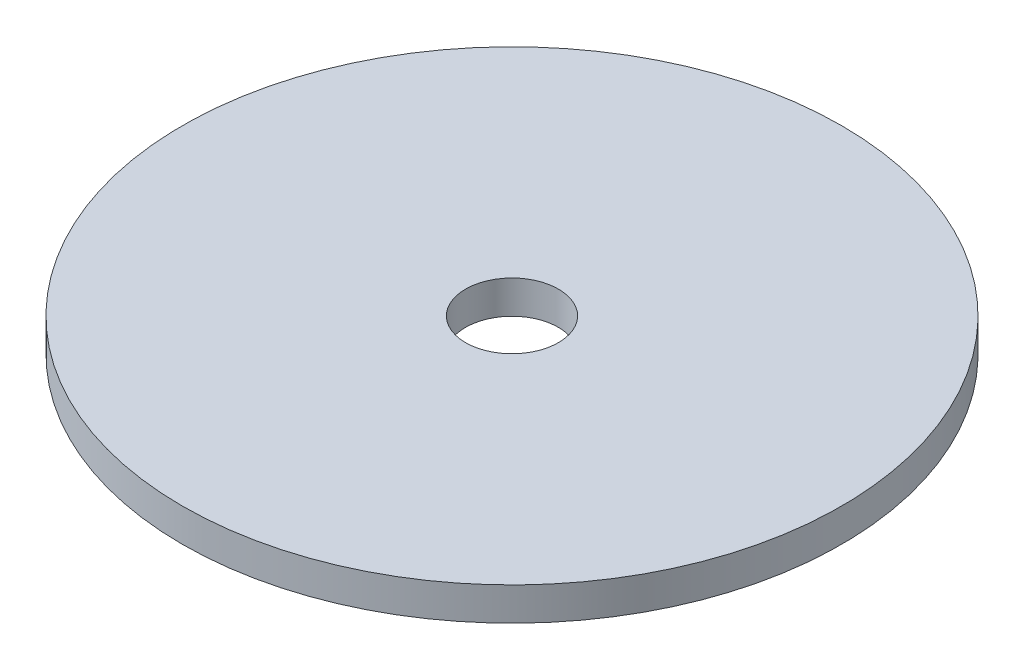
ISO-10303-21;
HEADER;
FILE_DESCRIPTION(('STEP AP214'),'2;1');
FILE_NAME('part.step','',(''),(''),'','','');
FILE_SCHEMA(('AUTOMOTIVE_DESIGN { 1 0 10303 214 1 1 1 1 }'));
ENDSEC;
DATA;
#1=APPLICATION_CONTEXT('core data for automotive mechanical design processes');
#2=APPLICATION_PROTOCOL_DEFINITION('international standard','automotive_design',2000,#1);
#3=PRODUCT_CONTEXT('',#1,'mechanical');
#4=PRODUCT('Part','Part','',(#3));
#5=PRODUCT_RELATED_PRODUCT_CATEGORY('part','',(#4));
#6=PRODUCT_DEFINITION_FORMATION('','',#4);
#7=PRODUCT_DEFINITION_CONTEXT('part definition',#1,'design');
#8=PRODUCT_DEFINITION('design','',#6,#7);
#9=PRODUCT_DEFINITION_SHAPE('','',#8);
#10=(LENGTH_UNIT() NAMED_UNIT(*) SI_UNIT(.MILLI.,.METRE.));
#11=(NAMED_UNIT(*) PLANE_ANGLE_UNIT() SI_UNIT($,.RADIAN.));
#12=(NAMED_UNIT(*) SI_UNIT($,.STERADIAN.) SOLID_ANGLE_UNIT());
#13=UNCERTAINTY_MEASURE_WITH_UNIT(LENGTH_MEASURE(1.E-05),#10,'distance_accuracy_value','');
#14=(GEOMETRIC_REPRESENTATION_CONTEXT(3) GLOBAL_UNCERTAINTY_ASSIGNED_CONTEXT((#13)) GLOBAL_UNIT_ASSIGNED_CONTEXT((#10,
#11,#12)) REPRESENTATION_CONTEXT('',''));
#15=CARTESIAN_POINT('',(0.,0.,0.));
#16=DIRECTION('',(0.,0.,1.));
#17=DIRECTION('',(1.,0.,0.));
#18=AXIS2_PLACEMENT_3D('',#15,#16,#17);
#19=CARTESIAN_POINT('',(0.,6.125,0.));
#20=DIRECTION('',(0.,1.,0.));
#21=DIRECTION('',(0.,0.,1.));
#22=AXIS2_PLACEMENT_3D('',#19,#20,#21);
#23=PLANE('',#22);
#24=CARTESIAN_POINT('',(0.,6.125,0.));
#25=DIRECTION('',(0.,1.,0.));
#26=DIRECTION('',(0.,0.,1.));
#27=AXIS2_PLACEMENT_3D('',#24,#25,#26);
#28=CIRCLE('',#27,121.765);
#29=CARTESIAN_POINT('',(0.,6.125,121.765));
#30=VERTEX_POINT('',#29);
#31=EDGE_CURVE('E10',#30,#30,#28,.T.);
#32=ORIENTED_EDGE('',*,*,#31,.T.);
#33=EDGE_LOOP('',(#32));
#34=FACE_BOUND('',#33,.T.);
#35=CARTESIAN_POINT('',(0.,6.125,0.));
#36=DIRECTION('',(0.,1.,0.));
#37=DIRECTION('',(0.,0.,1.));
#38=AXIS2_PLACEMENT_3D('',#35,#36,#37);
#39=CIRCLE('',#38,17.15);
#40=CARTESIAN_POINT('',(0.,6.125,17.15));
#41=VERTEX_POINT('',#40);
#42=EDGE_CURVE('E46',#41,#41,#39,.T.);
#43=ORIENTED_EDGE('',*,*,#42,.F.);
#44=EDGE_LOOP('',(#43));
#45=FACE_BOUND('',#44,.T.);
#46=ADVANCED_FACE('F35',(#34,#45),#23,.T.);
#47=CARTESIAN_POINT('',(0.,-6.125,0.));
#48=DIRECTION('',(0.,1.,0.));
#49=DIRECTION('',(0.,0.,1.));
#50=AXIS2_PLACEMENT_3D('',#47,#48,#49);
#51=PLANE('',#50);
#52=CARTESIAN_POINT('',(0.,-6.125,0.));
#53=DIRECTION('',(0.,1.,0.));
#54=DIRECTION('',(0.,0.,1.));
#55=AXIS2_PLACEMENT_3D('',#52,#53,#54);
#56=CIRCLE('',#55,121.765);
#57=CARTESIAN_POINT('',(0.,-6.125,121.765));
#58=VERTEX_POINT('',#57);
#59=EDGE_CURVE('E39',#58,#58,#56,.T.);
#60=ORIENTED_EDGE('',*,*,#59,.F.);
#61=EDGE_LOOP('',(#60));
#62=FACE_BOUND('',#61,.T.);
#63=CARTESIAN_POINT('',(0.,-6.125,0.));
#64=DIRECTION('',(0.,1.,0.));
#65=DIRECTION('',(0.,0.,1.));
#66=AXIS2_PLACEMENT_3D('',#63,#64,#65);
#67=CIRCLE('',#66,17.15);
#68=CARTESIAN_POINT('',(0.,-6.125,17.15));
#69=VERTEX_POINT('',#68);
#70=EDGE_CURVE('E48',#69,#69,#67,.T.);
#71=ORIENTED_EDGE('',*,*,#70,.T.);
#72=EDGE_LOOP('',(#71));
#73=FACE_BOUND('',#72,.T.);
#74=ADVANCED_FACE('F58',(#62,#73),#51,.F.);
#75=CARTESIAN_POINT('',(0.,6.125,0.));
#76=DIRECTION('',(0.,-1.,0.));
#77=DIRECTION('',(0.,0.,-1.));
#78=AXIS2_PLACEMENT_3D('',#75,#76,#77);
#79=CYLINDRICAL_SURFACE('',#78,121.765);
#80=ORIENTED_EDGE('',*,*,#31,.F.);
#81=EDGE_LOOP('',(#80));
#82=FACE_BOUND('',#81,.T.);
#83=ORIENTED_EDGE('',*,*,#59,.T.);
#84=EDGE_LOOP('',(#83));
#85=FACE_BOUND('',#84,.T.);
#86=ADVANCED_FACE('F37',(#82,#85),#79,.T.);
#87=CARTESIAN_POINT('',(0.,6.125,0.));
#88=DIRECTION('',(0.,-1.,0.));
#89=DIRECTION('',(0.,0.,-1.));
#90=AXIS2_PLACEMENT_3D('',#87,#88,#89);
#91=CYLINDRICAL_SURFACE('',#90,17.15);
#92=ORIENTED_EDGE('',*,*,#42,.T.);
#93=EDGE_LOOP('',(#92));
#94=FACE_BOUND('',#93,.T.);
#95=ORIENTED_EDGE('',*,*,#70,.F.);
#96=EDGE_LOOP('',(#95));
#97=FACE_BOUND('',#96,.T.);
#98=ADVANCED_FACE('F54',(#94,#97),#91,.F.);
#99=CLOSED_SHELL('',(#46,#74,#86,#98));
#100=MANIFOLD_SOLID_BREP('B2',#99);
#101=ADVANCED_BREP_SHAPE_REPRESENTATION('',(#18,#100),#14);
#102=SHAPE_DEFINITION_REPRESENTATION(#9,#101);
ENDSEC;
END-ISO-10303-21;
